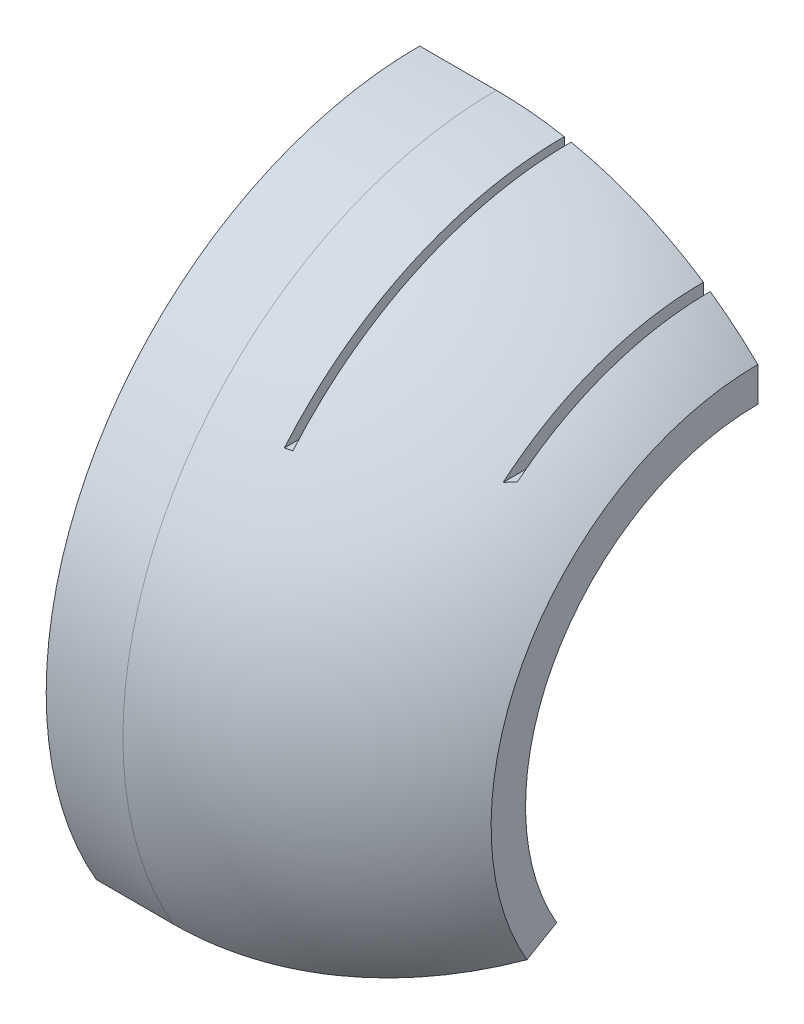
ISO-10303-21;
HEADER;
FILE_DESCRIPTION(('STEP AP214'),'2;1');
FILE_NAME('part.step','',(''),(''),'','','');
FILE_SCHEMA(('AUTOMOTIVE_DESIGN { 1 0 10303 214 1 1 1 1 }'));
ENDSEC;
DATA;
#1=APPLICATION_CONTEXT('core data for automotive mechanical design processes');
#2=APPLICATION_PROTOCOL_DEFINITION('international standard','automotive_design',2000,#1);
#3=PRODUCT_CONTEXT('',#1,'mechanical');
#4=PRODUCT('Part','Part','',(#3));
#5=PRODUCT_RELATED_PRODUCT_CATEGORY('part','',(#4));
#6=PRODUCT_DEFINITION_FORMATION('','',#4);
#7=PRODUCT_DEFINITION_CONTEXT('part definition',#1,'design');
#8=PRODUCT_DEFINITION('design','',#6,#7);
#9=PRODUCT_DEFINITION_SHAPE('','',#8);
#10=(LENGTH_UNIT() NAMED_UNIT(*) SI_UNIT(.MILLI.,.METRE.));
#11=(NAMED_UNIT(*) PLANE_ANGLE_UNIT() SI_UNIT($,.RADIAN.));
#12=(NAMED_UNIT(*) SI_UNIT($,.STERADIAN.) SOLID_ANGLE_UNIT());
#13=UNCERTAINTY_MEASURE_WITH_UNIT(LENGTH_MEASURE(1.E-05),#10,'distance_accuracy_value','');
#14=(GEOMETRIC_REPRESENTATION_CONTEXT(3) GLOBAL_UNCERTAINTY_ASSIGNED_CONTEXT((#13)) GLOBAL_UNIT_ASSIGNED_CONTEXT((#10,
#11,#12)) REPRESENTATION_CONTEXT('',''));
#15=CARTESIAN_POINT('',(0.,0.,0.));
#16=DIRECTION('',(0.,0.,1.));
#17=DIRECTION('',(1.,0.,0.));
#18=AXIS2_PLACEMENT_3D('',#15,#16,#17);
#19=CARTESIAN_POINT('',(0.,0.,0.));
#20=DIRECTION('',(-1.,0.,0.));
#21=DIRECTION('',(0.,0.,1.));
#22=AXIS2_PLACEMENT_3D('',#19,#20,#21);
#23=CYLINDRICAL_SURFACE('',#22,55.);
#24=CARTESIAN_POINT('',(11.3,0.,0.));
#25=DIRECTION('',(-1.,0.,0.));
#26=DIRECTION('',(0.,0.,1.));
#27=AXIS2_PLACEMENT_3D('',#24,#25,#26);
#28=CIRCLE('',#27,55.);
#29=CARTESIAN_POINT('',(11.3,-27.5000000000002,47.631397208144));
#30=VERTEX_POINT('',#29);
#31=CARTESIAN_POINT('',(11.3,55.,1.92031473636372E-13));
#32=VERTEX_POINT('',#31);
#33=EDGE_CURVE('E144',#30,#32,#28,.T.);
#34=ORIENTED_EDGE('',*,*,#33,.F.);
#35=DIRECTION('',(1.,0.,0.));
#36=VECTOR('',#35,1.);
#37=CARTESIAN_POINT('',(12.6,-27.5000000000002,47.631397208144));
#38=LINE('',#37,#36);
#39=CARTESIAN_POINT('',(22.6,-27.5000000000002,47.631397208144));
#40=VERTEX_POINT('',#39);
#41=EDGE_CURVE('E53',#30,#40,#38,.T.);
#42=ORIENTED_EDGE('',*,*,#41,.T.);
#43=CARTESIAN_POINT('',(22.6,0.,0.));
#44=DIRECTION('',(-1.,0.,0.));
#45=DIRECTION('',(0.,0.,1.));
#46=AXIS2_PLACEMENT_3D('',#43,#44,#45);
#47=CIRCLE('',#46,55.);
#48=CARTESIAN_POINT('',(22.6,55.,0.));
#49=VERTEX_POINT('',#48);
#50=EDGE_CURVE('E146',#40,#49,#47,.T.);
#51=ORIENTED_EDGE('',*,*,#50,.T.);
#52=DIRECTION('',(1.,0.,0.));
#53=VECTOR('',#52,1.);
#54=CARTESIAN_POINT('',(12.6,55.,0.));
#55=LINE('',#54,#53);
#56=EDGE_CURVE('E142',#32,#49,#55,.T.);
#57=ORIENTED_EDGE('',*,*,#56,.F.);
#58=EDGE_LOOP('',(#34,#42,#51,#57));
#59=FACE_BOUND('',#58,.T.);
#60=ADVANCED_FACE('F40',(#59),#23,.T.);
#61=CARTESIAN_POINT('',(0.,0.,0.));
#62=DIRECTION('',(-1.,0.,0.));
#63=DIRECTION('',(0.,0.,1.));
#64=AXIS2_PLACEMENT_3D('',#61,#62,#63);
#65=CYLINDRICAL_SURFACE('',#64,51.5);
#66=DIRECTION('',(1.,0.,0.));
#67=VECTOR('',#66,1.);
#68=CARTESIAN_POINT('',(22.6,-25.7500000000002,44.6003082948985));
#69=LINE('',#68,#67);
#70=CARTESIAN_POINT('',(11.3,-25.7500000000002,44.6003082948985));
#71=VERTEX_POINT('',#70);
#72=CARTESIAN_POINT('',(22.6,-25.7500000000002,44.6003082948985));
#73=VERTEX_POINT('',#72);
#74=EDGE_CURVE('E239',#71,#73,#69,.T.);
#75=ORIENTED_EDGE('',*,*,#74,.F.);
#76=CARTESIAN_POINT('',(11.3,0.,0.));
#77=DIRECTION('',(-1.,0.,0.));
#78=DIRECTION('',(0.,0.,1.));
#79=AXIS2_PLACEMENT_3D('',#76,#77,#78);
#80=CIRCLE('',#79,51.5);
#81=CARTESIAN_POINT('',(11.3,51.5,1.79811288950421E-13));
#82=VERTEX_POINT('',#81);
#83=EDGE_CURVE('E155',#82,#71,#80,.F.);
#84=ORIENTED_EDGE('',*,*,#83,.F.);
#85=DIRECTION('',(1.,0.,0.));
#86=VECTOR('',#85,1.);
#87=CARTESIAN_POINT('',(22.6,51.5,0.));
#88=LINE('',#87,#86);
#89=CARTESIAN_POINT('',(22.6,51.5,0.));
#90=VERTEX_POINT('',#89);
#91=EDGE_CURVE('E61',#90,#82,#88,.F.);
#92=ORIENTED_EDGE('',*,*,#91,.F.);
#93=CARTESIAN_POINT('',(22.6,0.,0.));
#94=DIRECTION('',(-1.,0.,0.));
#95=DIRECTION('',(0.,0.,1.));
#96=AXIS2_PLACEMENT_3D('',#93,#94,#95);
#97=CIRCLE('',#96,51.5);
#98=EDGE_CURVE('E213',#90,#73,#97,.F.);
#99=ORIENTED_EDGE('',*,*,#98,.T.);
#100=EDGE_LOOP('',(#75,#84,#92,#99));
#101=FACE_BOUND('',#100,.T.);
#102=ADVANCED_FACE('F243',(#101),#65,.F.);
#103=CARTESIAN_POINT('',(22.6,0.,0.));
#104=DIRECTION('',(0.,0.,1.));
#105=DIRECTION('',(-1.,0.,0.));
#106=AXIS2_PLACEMENT_3D('',#103,#104,#105);
#107=PLANE('',#106);
#108=CARTESIAN_POINT('',(22.6,0.,0.));
#109=DIRECTION('',(0.,0.,-1.));
#110=DIRECTION('',(-1.,0.,0.));
#111=AXIS2_PLACEMENT_3D('',#108,#109,#110);
#112=CIRCLE('',#111,55.);
#113=CARTESIAN_POINT('',(54.1,45.0860288781347,0.));
#114=VERTEX_POINT('',#113);
#115=CARTESIAN_POINT('',(61.1,39.2778563569857,0.));
#116=VERTEX_POINT('',#115);
#117=EDGE_CURVE('E195',#114,#116,#112,.T.);
#118=ORIENTED_EDGE('',*,*,#117,.T.);
#119=DIRECTION('',(0.,1.,0.));
#120=VECTOR('',#119,1.);
#121=CARTESIAN_POINT('',(61.1,0.,0.));
#122=LINE('',#121,#120);
#123=CARTESIAN_POINT('',(61.1,34.2052627529741,0.));
#124=VERTEX_POINT('',#123);
#125=EDGE_CURVE('E215',#124,#116,#122,.T.);
#126=ORIENTED_EDGE('',*,*,#125,.F.);
#127=CARTESIAN_POINT('',(22.6,0.,0.));
#128=DIRECTION('',(0.,0.,-1.));
#129=DIRECTION('',(-1.,0.,0.));
#130=AXIS2_PLACEMENT_3D('',#127,#128,#129);
#131=CIRCLE('',#130,51.5);
#132=CARTESIAN_POINT('',(54.1,40.7430975749267,0.));
#133=VERTEX_POINT('',#132);
#134=EDGE_CURVE('E200',#124,#133,#131,.F.);
#135=ORIENTED_EDGE('',*,*,#134,.T.);
#136=DIRECTION('',(0.,-1.,0.));
#137=VECTOR('',#136,1.);
#138=CARTESIAN_POINT('',(54.1,0.,0.));
#139=LINE('',#138,#137);
#140=EDGE_CURVE('E230',#114,#133,#139,.T.);
#141=ORIENTED_EDGE('',*,*,#140,.F.);
#142=EDGE_LOOP('',(#118,#126,#135,#141));
#143=FACE_BOUND('',#142,.T.);
#144=ADVANCED_FACE('F260',(#143),#107,.F.);
#145=CARTESIAN_POINT('',(32.6,50.519798099359,0.));
#146=VERTEX_POINT('',#145);
#147=EDGE_CURVE('E198',#146,#90,#131,.F.);
#148=ORIENTED_EDGE('',*,*,#147,.T.);
#149=ORIENTED_EDGE('',*,*,#91,.T.);
#150=DIRECTION('',(0.,1.,0.));
#151=VECTOR('',#150,1.);
#152=CARTESIAN_POINT('',(11.3,1.92031473636372E-13,0.));
#153=LINE('',#152,#151);
#154=EDGE_CURVE('E47',#82,#32,#153,.T.);
#155=ORIENTED_EDGE('',*,*,#154,.T.);
#156=ORIENTED_EDGE('',*,*,#56,.T.);
#157=CARTESIAN_POINT('',(32.6,54.0832691319598,0.));
#158=VERTEX_POINT('',#157);
#159=EDGE_CURVE('E196',#49,#158,#112,.T.);
#160=ORIENTED_EDGE('',*,*,#159,.T.);
#161=DIRECTION('',(0.,1.,0.));
#162=VECTOR('',#161,1.);
#163=CARTESIAN_POINT('',(32.6,0.,0.));
#164=LINE('',#163,#162);
#165=EDGE_CURVE('E225',#146,#158,#164,.T.);
#166=ORIENTED_EDGE('',*,*,#165,.F.);
#167=EDGE_LOOP('',(#148,#149,#155,#156,#160,#166));
#168=FACE_BOUND('',#167,.T.);
#169=ADVANCED_FACE('F151',(#168),#107,.F.);
#170=CARTESIAN_POINT('',(22.6,0.,0.));
#171=DIRECTION('',(0.,-1.,0.));
#172=DIRECTION('',(1.,0.,0.));
#173=AXIS2_PLACEMENT_3D('',#170,#171,#172);
#174=SPHERICAL_SURFACE('',#173,51.5);
#175=ORIENTED_EDGE('',*,*,#134,.F.);
#176=CARTESIAN_POINT('',(61.1,0.,0.));
#177=DIRECTION('',(-1.,0.,0.));
#178=DIRECTION('',(0.,0.,1.));
#179=AXIS2_PLACEMENT_3D('',#176,#177,#178);
#180=CIRCLE('',#179,34.2052627529741);
#181=CARTESIAN_POINT('',(61.1,-17.1026313764872,29.6226264871972));
#182=VERTEX_POINT('',#181);
#183=EDGE_CURVE('E210',#124,#182,#180,.F.);
#184=ORIENTED_EDGE('',*,*,#183,.T.);
#185=CARTESIAN_POINT('',(22.6,0.,0.));
#186=DIRECTION('',(0.,-0.866025403784436,-0.500000000000004));
#187=DIRECTION('',(0.,-0.500000000000004,0.866025403784436));
#188=AXIS2_PLACEMENT_3D('',#185,#186,#187);
#189=CIRCLE('',#188,51.5);
#190=EDGE_CURVE('E206',#73,#182,#189,.F.);
#191=ORIENTED_EDGE('',*,*,#190,.F.);
#192=ORIENTED_EDGE('',*,*,#98,.F.);
#193=ORIENTED_EDGE('',*,*,#147,.F.);
#194=CARTESIAN_POINT('',(32.6,0.,0.));
#195=DIRECTION('',(1.,0.,0.));
#196=DIRECTION('',(0.,0.,-1.));
#197=AXIS2_PLACEMENT_3D('',#194,#195,#196);
#198=CIRCLE('',#197,50.519798099359);
#199=CARTESIAN_POINT('',(32.6,35.,36.4314424638937));
#200=VERTEX_POINT('',#199);
#201=EDGE_CURVE('E176',#200,#146,#198,.F.);
#202=ORIENTED_EDGE('',*,*,#201,.F.);
#203=CARTESIAN_POINT('',(22.6,35.,0.));
#204=DIRECTION('',(0.,1.,0.));
#205=DIRECTION('',(0.,0.,-1.));
#206=AXIS2_PLACEMENT_3D('',#203,#204,#205);
#207=CIRCLE('',#206,37.7789623997272);
#208=CARTESIAN_POINT('',(33.6,35.,36.1420807370024));
#209=VERTEX_POINT('',#208);
#210=EDGE_CURVE('E189',#209,#200,#207,.F.);
#211=ORIENTED_EDGE('',*,*,#210,.F.);
#212=CARTESIAN_POINT('',(33.6,0.,0.));
#213=DIRECTION('',(-1.,0.,0.));
#214=DIRECTION('',(0.,-1.,0.));
#215=AXIS2_PLACEMENT_3D('',#212,#213,#214);
#216=CIRCLE('',#215,50.3115294937453);
#217=CARTESIAN_POINT('',(33.6,50.3115294937453,0.));
#218=VERTEX_POINT('',#217);
#219=EDGE_CURVE('E170',#218,#209,#216,.F.);
#220=ORIENTED_EDGE('',*,*,#219,.F.);
#221=CARTESIAN_POINT('',(53.1,41.4969878424928,0.));
#222=VERTEX_POINT('',#221);
#223=EDGE_CURVE('E204',#222,#218,#131,.F.);
#224=ORIENTED_EDGE('',*,*,#223,.F.);
#225=CARTESIAN_POINT('',(53.1,0.,0.));
#226=DIRECTION('',(1.,0.,0.));
#227=DIRECTION('',(0.,1.,0.));
#228=AXIS2_PLACEMENT_3D('',#225,#226,#227);
#229=CIRCLE('',#228,41.4969878424928);
#230=CARTESIAN_POINT('',(53.1,35.,22.2934968096079));
#231=VERTEX_POINT('',#230);
#232=EDGE_CURVE('E181',#231,#222,#229,.F.);
#233=ORIENTED_EDGE('',*,*,#232,.F.);
#234=CARTESIAN_POINT('',(22.6,35.,0.));
#235=DIRECTION('',(0.,1.,0.));
#236=DIRECTION('',(0.,0.,-1.));
#237=AXIS2_PLACEMENT_3D('',#234,#235,#236);
#238=CIRCLE('',#237,37.7789623997272);
#239=CARTESIAN_POINT('',(54.1,35.,20.8566536146142));
#240=VERTEX_POINT('',#239);
#241=EDGE_CURVE('E192',#240,#231,#238,.F.);
#242=ORIENTED_EDGE('',*,*,#241,.F.);
#243=CARTESIAN_POINT('',(54.1,0.,0.));
#244=DIRECTION('',(-1.,0.,0.));
#245=DIRECTION('',(0.,0.,1.));
#246=AXIS2_PLACEMENT_3D('',#243,#244,#245);
#247=CIRCLE('',#246,40.7430975749267);
#248=EDGE_CURVE('E186',#133,#240,#247,.F.);
#249=ORIENTED_EDGE('',*,*,#248,.F.);
#250=EDGE_LOOP('',(#175,#184,#191,#192,#193,#202,#211,#220,#224,#233,#242,#249));
#251=FACE_BOUND('',#250,.T.);
#252=ADVANCED_FACE('F274',(#251),#174,.F.);
#253=CARTESIAN_POINT('',(22.6,0.,0.));
#254=DIRECTION('',(0.,-1.,0.));
#255=DIRECTION('',(1.,0.,0.));
#256=AXIS2_PLACEMENT_3D('',#253,#254,#255);
#257=SPHERICAL_SURFACE('',#256,55.);
#258=CARTESIAN_POINT('',(22.6,35.,0.));
#259=DIRECTION('',(0.,1.,0.));
#260=DIRECTION('',(0.,0.,-1.));
#261=AXIS2_PLACEMENT_3D('',#258,#259,#260);
#262=CIRCLE('',#261,42.4264068711928);
#263=CARTESIAN_POINT('',(53.1,35.,29.4915242061173));
#264=VERTEX_POINT('',#263);
#265=CARTESIAN_POINT('',(54.1,35.,28.4209429822446));
#266=VERTEX_POINT('',#265);
#267=EDGE_CURVE('E236',#264,#266,#262,.T.);
#268=ORIENTED_EDGE('',*,*,#267,.F.);
#269=CARTESIAN_POINT('',(53.1,0.,0.));
#270=DIRECTION('',(1.,0.,0.));
#271=DIRECTION('',(0.,1.,0.));
#272=AXIS2_PLACEMENT_3D('',#269,#270,#271);
#273=CIRCLE('',#272,45.7684389071771);
#274=CARTESIAN_POINT('',(53.1,45.7684389071771,0.));
#275=VERTEX_POINT('',#274);
#276=EDGE_CURVE('E178',#275,#264,#273,.T.);
#277=ORIENTED_EDGE('',*,*,#276,.F.);
#278=CARTESIAN_POINT('',(33.6,53.8887743412299,0.));
#279=VERTEX_POINT('',#278);
#280=EDGE_CURVE('E199',#279,#275,#112,.T.);
#281=ORIENTED_EDGE('',*,*,#280,.F.);
#282=CARTESIAN_POINT('',(33.6,0.,0.));
#283=DIRECTION('',(-1.,0.,0.));
#284=DIRECTION('',(0.,-1.,0.));
#285=AXIS2_PLACEMENT_3D('',#282,#283,#284);
#286=CIRCLE('',#285,53.8887743412299);
#287=CARTESIAN_POINT('',(33.6,35.,40.9756024970958));
#288=VERTEX_POINT('',#287);
#289=EDGE_CURVE('E162',#288,#279,#286,.T.);
#290=ORIENTED_EDGE('',*,*,#289,.F.);
#291=CARTESIAN_POINT('',(22.6,35.,0.));
#292=DIRECTION('',(0.,1.,0.));
#293=DIRECTION('',(0.,0.,-1.));
#294=AXIS2_PLACEMENT_3D('',#291,#292,#293);
#295=CIRCLE('',#294,42.4264068711928);
#296=CARTESIAN_POINT('',(32.6,35.,41.2310562561766));
#297=VERTEX_POINT('',#296);
#298=EDGE_CURVE('E233',#297,#288,#295,.T.);
#299=ORIENTED_EDGE('',*,*,#298,.F.);
#300=CARTESIAN_POINT('',(32.6,0.,0.));
#301=DIRECTION('',(1.,0.,0.));
#302=DIRECTION('',(0.,0.,-1.));
#303=AXIS2_PLACEMENT_3D('',#300,#301,#302);
#304=CIRCLE('',#303,54.0832691319598);
#305=EDGE_CURVE('E173',#158,#297,#304,.T.);
#306=ORIENTED_EDGE('',*,*,#305,.F.);
#307=ORIENTED_EDGE('',*,*,#159,.F.);
#308=ORIENTED_EDGE('',*,*,#50,.F.);
#309=CARTESIAN_POINT('',(22.6,0.,0.));
#310=DIRECTION('',(0.,-0.866025403784436,-0.500000000000004));
#311=DIRECTION('',(0.,-0.500000000000004,0.866025403784436));
#312=AXIS2_PLACEMENT_3D('',#309,#310,#311);
#313=CIRCLE('',#312,55.);
#314=CARTESIAN_POINT('',(61.1,-19.638928178493,34.0156214113456));
#315=VERTEX_POINT('',#314);
#316=EDGE_CURVE('E203',#315,#40,#313,.T.);
#317=ORIENTED_EDGE('',*,*,#316,.F.);
#318=CARTESIAN_POINT('',(61.1,0.,0.));
#319=DIRECTION('',(-1.,0.,0.));
#320=DIRECTION('',(0.,0.,1.));
#321=AXIS2_PLACEMENT_3D('',#318,#319,#320);
#322=CIRCLE('',#321,39.2778563569857);
#323=EDGE_CURVE('E209',#315,#116,#322,.T.);
#324=ORIENTED_EDGE('',*,*,#323,.T.);
#325=ORIENTED_EDGE('',*,*,#117,.F.);
#326=CARTESIAN_POINT('',(54.1,0.,0.));
#327=DIRECTION('',(-1.,0.,0.));
#328=DIRECTION('',(0.,0.,1.));
#329=AXIS2_PLACEMENT_3D('',#326,#327,#328);
#330=CIRCLE('',#329,45.0860288781347);
#331=EDGE_CURVE('E184',#266,#114,#330,.T.);
#332=ORIENTED_EDGE('',*,*,#331,.F.);
#333=EDGE_LOOP('',(#268,#277,#281,#290,#299,#306,#307,#308,#317,#324,#325,#332));
#334=FACE_BOUND('',#333,.T.);
#335=ADVANCED_FACE('F271',(#334),#257,.T.);
#336=CARTESIAN_POINT('',(61.1,0.,-55.));
#337=DIRECTION('',(1.,0.,0.));
#338=DIRECTION('',(0.,0.,1.));
#339=AXIS2_PLACEMENT_3D('',#336,#337,#338);
#340=PLANE('',#339);
#341=DIRECTION('',(0.,0.500000000000004,-0.866025403784436));
#342=VECTOR('',#341,1.);
#343=CARTESIAN_POINT('',(61.1,23.8156986040722,-41.2499999999998));
#344=LINE('',#343,#342);
#345=EDGE_CURVE('E221',#315,#182,#344,.T.);
#346=ORIENTED_EDGE('',*,*,#345,.T.);
#347=ORIENTED_EDGE('',*,*,#183,.F.);
#348=ORIENTED_EDGE('',*,*,#125,.T.);
#349=ORIENTED_EDGE('',*,*,#323,.F.);
#350=EDGE_LOOP('',(#346,#347,#348,#349));
#351=FACE_BOUND('',#350,.T.);
#352=ADVANCED_FACE('F257',(#351),#340,.T.);
#353=ORIENTED_EDGE('',*,*,#223,.T.);
#354=DIRECTION('',(0.,-1.,0.));
#355=VECTOR('',#354,1.);
#356=CARTESIAN_POINT('',(33.6,0.,0.));
#357=LINE('',#356,#355);
#358=EDGE_CURVE('E223',#279,#218,#357,.T.);
#359=ORIENTED_EDGE('',*,*,#358,.F.);
#360=ORIENTED_EDGE('',*,*,#280,.T.);
#361=DIRECTION('',(0.,1.,0.));
#362=VECTOR('',#361,1.);
#363=CARTESIAN_POINT('',(53.1,0.,0.));
#364=LINE('',#363,#362);
#365=EDGE_CURVE('E228',#222,#275,#364,.T.);
#366=ORIENTED_EDGE('',*,*,#365,.F.);
#367=EDGE_LOOP('',(#353,#359,#360,#366));
#368=FACE_BOUND('',#367,.T.);
#369=ADVANCED_FACE('F248',(#368),#107,.F.);
#370=CARTESIAN_POINT('',(22.6,0.,0.));
#371=DIRECTION('',(0.,0.866025403784436,0.500000000000004));
#372=DIRECTION('',(0.,-0.500000000000004,0.866025403784436));
#373=AXIS2_PLACEMENT_3D('',#370,#371,#372);
#374=PLANE('',#373);
#375=ORIENTED_EDGE('',*,*,#190,.T.);
#376=ORIENTED_EDGE('',*,*,#345,.F.);
#377=ORIENTED_EDGE('',*,*,#316,.T.);
#378=ORIENTED_EDGE('',*,*,#41,.F.);
#379=DIRECTION('',(0.,0.500000000000004,-0.866025403784436));
#380=VECTOR('',#379,1.);
#381=CARTESIAN_POINT('',(11.3,-23.8156986040722,41.2499999999998));
#382=LINE('',#381,#380);
#383=EDGE_CURVE('E11',#30,#71,#382,.T.);
#384=ORIENTED_EDGE('',*,*,#383,.T.);
#385=ORIENTED_EDGE('',*,*,#74,.T.);
#386=EDGE_LOOP('',(#375,#376,#377,#378,#384,#385));
#387=FACE_BOUND('',#386,.T.);
#388=ADVANCED_FACE('F245',(#387),#374,.F.);
#389=CARTESIAN_POINT('',(33.6,35.,55.));
#390=DIRECTION('',(0.,-1.,0.));
#391=DIRECTION('',(0.,0.,-1.));
#392=AXIS2_PLACEMENT_3D('',#389,#390,#391);
#393=PLANE('',#392);
#394=DIRECTION('',(0.,0.,-1.));
#395=VECTOR('',#394,1.);
#396=CARTESIAN_POINT('',(33.6,35.,55.));
#397=LINE('',#396,#395);
#398=EDGE_CURVE('E149',#288,#209,#397,.T.);
#399=ORIENTED_EDGE('',*,*,#398,.T.);
#400=ORIENTED_EDGE('',*,*,#210,.T.);
#401=DIRECTION('',(0.,0.,-1.));
#402=VECTOR('',#401,1.);
#403=CARTESIAN_POINT('',(32.6,35.,55.));
#404=LINE('',#403,#402);
#405=EDGE_CURVE('E165',#297,#200,#404,.T.);
#406=ORIENTED_EDGE('',*,*,#405,.F.);
#407=ORIENTED_EDGE('',*,*,#298,.T.);
#408=EDGE_LOOP('',(#399,#400,#406,#407));
#409=FACE_BOUND('',#408,.T.);
#410=ADVANCED_FACE('F247',(#409),#393,.F.);
#411=CARTESIAN_POINT('',(32.6,35.,55.));
#412=DIRECTION('',(-1.,0.,0.));
#413=DIRECTION('',(0.,0.,-1.));
#414=AXIS2_PLACEMENT_3D('',#411,#412,#413);
#415=PLANE('',#414);
#416=ORIENTED_EDGE('',*,*,#405,.T.);
#417=ORIENTED_EDGE('',*,*,#201,.T.);
#418=ORIENTED_EDGE('',*,*,#165,.T.);
#419=ORIENTED_EDGE('',*,*,#305,.T.);
#420=EDGE_LOOP('',(#416,#417,#418,#419));
#421=FACE_BOUND('',#420,.T.);
#422=ADVANCED_FACE('F254',(#421),#415,.F.);
#423=CARTESIAN_POINT('',(33.6,55.,55.));
#424=DIRECTION('',(1.,0.,0.));
#425=DIRECTION('',(0.,-1.,0.));
#426=AXIS2_PLACEMENT_3D('',#423,#424,#425);
#427=PLANE('',#426);
#428=ORIENTED_EDGE('',*,*,#358,.T.);
#429=ORIENTED_EDGE('',*,*,#219,.T.);
#430=ORIENTED_EDGE('',*,*,#398,.F.);
#431=ORIENTED_EDGE('',*,*,#289,.T.);
#432=EDGE_LOOP('',(#428,#429,#430,#431));
#433=FACE_BOUND('',#432,.T.);
#434=ADVANCED_FACE('F298',(#433),#427,.F.);
#435=CARTESIAN_POINT('',(54.1,35.,55.));
#436=DIRECTION('',(0.,-1.,0.));
#437=DIRECTION('',(0.,0.,-1.));
#438=AXIS2_PLACEMENT_3D('',#435,#436,#437);
#439=PLANE('',#438);
#440=DIRECTION('',(0.,0.,-1.));
#441=VECTOR('',#440,1.);
#442=CARTESIAN_POINT('',(54.1,35.,55.));
#443=LINE('',#442,#441);
#444=EDGE_CURVE('E160',#266,#240,#443,.T.);
#445=ORIENTED_EDGE('',*,*,#444,.T.);
#446=ORIENTED_EDGE('',*,*,#241,.T.);
#447=DIRECTION('',(0.,0.,-1.));
#448=VECTOR('',#447,1.);
#449=CARTESIAN_POINT('',(53.1,35.,55.));
#450=LINE('',#449,#448);
#451=EDGE_CURVE('E163',#264,#231,#450,.T.);
#452=ORIENTED_EDGE('',*,*,#451,.F.);
#453=ORIENTED_EDGE('',*,*,#267,.T.);
#454=EDGE_LOOP('',(#445,#446,#452,#453));
#455=FACE_BOUND('',#454,.T.);
#456=ADVANCED_FACE('F309',(#455),#439,.F.);
#457=CARTESIAN_POINT('',(54.1,55.,55.));
#458=DIRECTION('',(1.,0.,0.));
#459=DIRECTION('',(0.,0.,1.));
#460=AXIS2_PLACEMENT_3D('',#457,#458,#459);
#461=PLANE('',#460);
#462=ORIENTED_EDGE('',*,*,#140,.T.);
#463=ORIENTED_EDGE('',*,*,#248,.T.);
#464=ORIENTED_EDGE('',*,*,#444,.F.);
#465=ORIENTED_EDGE('',*,*,#331,.T.);
#466=EDGE_LOOP('',(#462,#463,#464,#465));
#467=FACE_BOUND('',#466,.T.);
#468=ADVANCED_FACE('F313',(#467),#461,.F.);
#469=CARTESIAN_POINT('',(53.1,55.,55.));
#470=DIRECTION('',(-1.,0.,0.));
#471=DIRECTION('',(0.,1.,0.));
#472=AXIS2_PLACEMENT_3D('',#469,#470,#471);
#473=PLANE('',#472);
#474=ORIENTED_EDGE('',*,*,#451,.T.);
#475=ORIENTED_EDGE('',*,*,#232,.T.);
#476=ORIENTED_EDGE('',*,*,#365,.T.);
#477=ORIENTED_EDGE('',*,*,#276,.T.);
#478=EDGE_LOOP('',(#474,#475,#476,#477));
#479=FACE_BOUND('',#478,.T.);
#480=ADVANCED_FACE('F312',(#479),#473,.F.);
#481=CARTESIAN_POINT('',(11.3,0.,55.));
#482=DIRECTION('',(-1.,0.,0.));
#483=DIRECTION('',(0.,0.,1.));
#484=AXIS2_PLACEMENT_3D('',#481,#482,#483);
#485=PLANE('',#484);
#486=ORIENTED_EDGE('',*,*,#383,.F.);
#487=ORIENTED_EDGE('',*,*,#33,.T.);
#488=ORIENTED_EDGE('',*,*,#154,.F.);
#489=ORIENTED_EDGE('',*,*,#83,.T.);
#490=EDGE_LOOP('',(#486,#487,#488,#489));
#491=FACE_BOUND('',#490,.T.);
#492=ADVANCED_FACE('F156',(#491),#485,.T.);
#493=CLOSED_SHELL('',(#60,#102,#144,#169,#252,#335,#352,#369,#388,#410,#422,#434,#456,#468,#480,#492));
#494=MANIFOLD_SOLID_BREP('B2',#493);
#495=ADVANCED_BREP_SHAPE_REPRESENTATION('',(#18,#494),#14);
#496=SHAPE_DEFINITION_REPRESENTATION(#9,#495);
ENDSEC;
END-ISO-10303-21;
